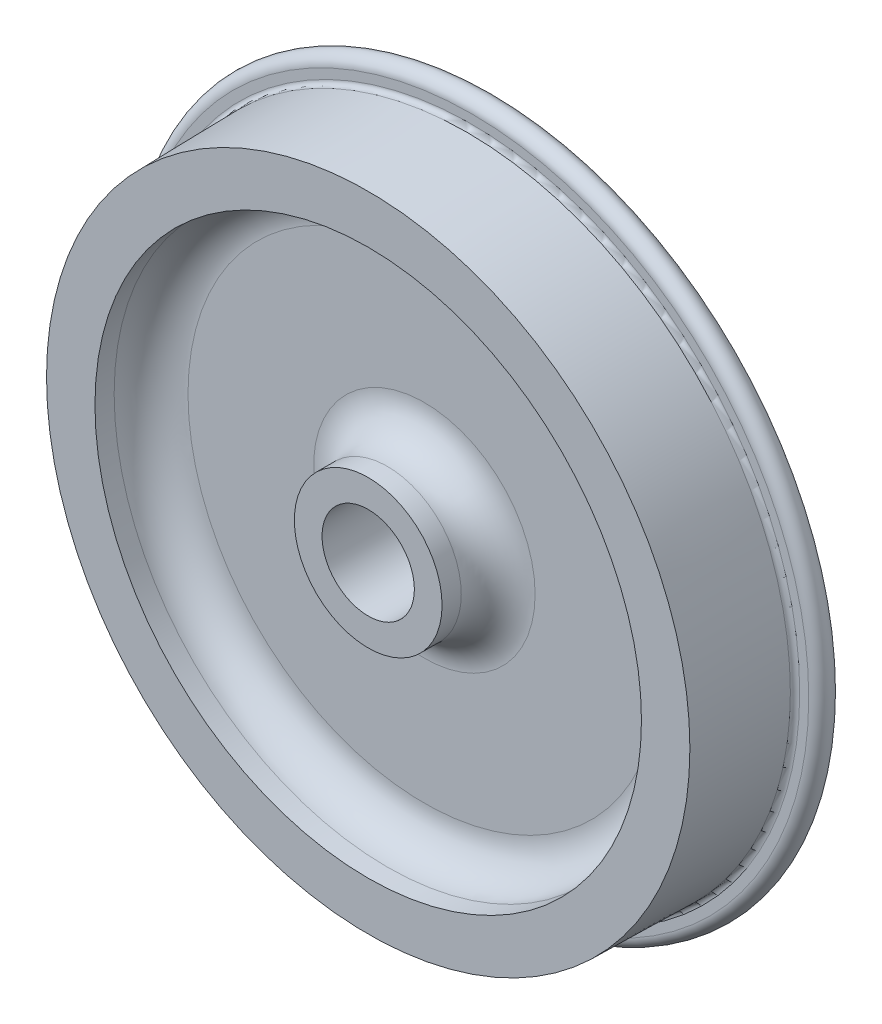
ISO-10303-21;
HEADER;
FILE_DESCRIPTION(('STEP AP214'),'2;1');
FILE_NAME('part.step','',(''),(''),'','','');
FILE_SCHEMA(('AUTOMOTIVE_DESIGN { 1 0 10303 214 1 1 1 1 }'));
ENDSEC;
DATA;
#1=APPLICATION_CONTEXT('core data for automotive mechanical design processes');
#2=APPLICATION_PROTOCOL_DEFINITION('international standard','automotive_design',2000,#1);
#3=PRODUCT_CONTEXT('',#1,'mechanical');
#4=PRODUCT('Part','Part','',(#3));
#5=PRODUCT_RELATED_PRODUCT_CATEGORY('part','',(#4));
#6=PRODUCT_DEFINITION_FORMATION('','',#4);
#7=PRODUCT_DEFINITION_CONTEXT('part definition',#1,'design');
#8=PRODUCT_DEFINITION('design','',#6,#7);
#9=PRODUCT_DEFINITION_SHAPE('','',#8);
#10=(LENGTH_UNIT() NAMED_UNIT(*) SI_UNIT(.MILLI.,.METRE.));
#11=(NAMED_UNIT(*) PLANE_ANGLE_UNIT() SI_UNIT($,.RADIAN.));
#12=(NAMED_UNIT(*) SI_UNIT($,.STERADIAN.) SOLID_ANGLE_UNIT());
#13=UNCERTAINTY_MEASURE_WITH_UNIT(LENGTH_MEASURE(1.E-05),#10,'distance_accuracy_value','');
#14=(GEOMETRIC_REPRESENTATION_CONTEXT(3) GLOBAL_UNCERTAINTY_ASSIGNED_CONTEXT((#13)) GLOBAL_UNIT_ASSIGNED_CONTEXT((#10,
#11,#12)) REPRESENTATION_CONTEXT('',''));
#15=CARTESIAN_POINT('',(0.,0.,0.));
#16=DIRECTION('',(0.,0.,1.));
#17=DIRECTION('',(1.,0.,0.));
#18=AXIS2_PLACEMENT_3D('',#15,#16,#17);
#19=CARTESIAN_POINT('',(0.,0.,-5.715));
#20=DIRECTION('',(0.,0.,1.));
#21=DIRECTION('',(1.,0.,0.));
#22=AXIS2_PLACEMENT_3D('',#19,#20,#21);
#23=TOROIDAL_SURFACE('',#22,57.9755,1.905);
#24=CARTESIAN_POINT('',(0.,0.,-7.62));
#25=DIRECTION('',(0.,0.,-1.));
#26=DIRECTION('',(-1.,0.,0.));
#27=AXIS2_PLACEMENT_3D('',#24,#25,#26);
#28=CIRCLE('',#27,57.9755);
#29=CARTESIAN_POINT('',(-57.9755,0.,-7.62));
#30=VERTEX_POINT('',#29);
#31=EDGE_CURVE('E41',#30,#30,#28,.T.);
#32=ORIENTED_EDGE('',*,*,#31,.F.);
#33=EDGE_LOOP('',(#32));
#34=FACE_BOUND('',#33,.T.);
#35=CARTESIAN_POINT('',(0.,0.,-3.81));
#36=DIRECTION('',(0.,0.,1.));
#37=DIRECTION('',(1.,0.,0.));
#38=AXIS2_PLACEMENT_3D('',#35,#36,#37);
#39=CIRCLE('',#38,57.9755);
#40=CARTESIAN_POINT('',(57.9755,0.,-3.81));
#41=VERTEX_POINT('',#40);
#42=EDGE_CURVE('E10',#41,#41,#39,.T.);
#43=ORIENTED_EDGE('',*,*,#42,.F.);
#44=EDGE_LOOP('',(#43));
#45=FACE_BOUND('',#44,.T.);
#46=ADVANCED_FACE('F35',(#34,#45),#23,.T.);
#47=CARTESIAN_POINT('',(0.,0.,-7.62));
#48=DIRECTION('',(0.,0.,-1.));
#49=DIRECTION('',(-1.,0.,0.));
#50=AXIS2_PLACEMENT_3D('',#47,#48,#49);
#51=PLANE('',#50);
#52=ORIENTED_EDGE('',*,*,#31,.T.);
#53=EDGE_LOOP('',(#52));
#54=FACE_BOUND('',#53,.T.);
#55=CARTESIAN_POINT('',(0.,0.,-7.62));
#56=DIRECTION('',(0.,0.,1.));
#57=DIRECTION('',(1.,0.,0.));
#58=AXIS2_PLACEMENT_3D('',#55,#56,#57);
#59=CIRCLE('',#58,7.9375);
#60=CARTESIAN_POINT('',(7.9375,0.,-7.62));
#61=VERTEX_POINT('',#60);
#62=EDGE_CURVE('E76',#61,#61,#59,.T.);
#63=ORIENTED_EDGE('',*,*,#62,.T.);
#64=EDGE_LOOP('',(#63));
#65=FACE_BOUND('',#64,.T.);
#66=ADVANCED_FACE('F82',(#54,#65),#51,.T.);
#67=CARTESIAN_POINT('',(0.,0.,-3.81));
#68=DIRECTION('',(0.,0.,1.));
#69=DIRECTION('',(1.,0.,0.));
#70=AXIS2_PLACEMENT_3D('',#67,#68,#69);
#71=PLANE('',#70);
#72=ORIENTED_EDGE('',*,*,#42,.T.);
#73=EDGE_LOOP('',(#72));
#74=FACE_BOUND('',#73,.T.);
#75=CARTESIAN_POINT('',(0.,0.,-3.81));
#76=DIRECTION('',(0.,0.,1.));
#77=DIRECTION('',(1.,0.,0.));
#78=AXIS2_PLACEMENT_3D('',#75,#76,#77);
#79=CIRCLE('',#78,56.4277401328369);
#80=CARTESIAN_POINT('',(56.4277401328369,0.,-3.81));
#81=VERTEX_POINT('',#80);
#82=EDGE_CURVE('E49',#81,#81,#79,.F.);
#83=ORIENTED_EDGE('',*,*,#82,.T.);
#84=EDGE_LOOP('',(#83));
#85=FACE_BOUND('',#84,.T.);
#86=ADVANCED_FACE('F117',(#74,#85),#71,.T.);
#87=CARTESIAN_POINT('',(0.,0.,13.97));
#88=DIRECTION('',(0.,0.,1.));
#89=DIRECTION('',(1.,0.,0.));
#90=AXIS2_PLACEMENT_3D('',#87,#88,#89);
#91=PLANE('',#90);
#92=CARTESIAN_POINT('',(0.,0.,13.97));
#93=DIRECTION('',(0.,0.,1.));
#94=DIRECTION('',(1.,0.,0.));
#95=AXIS2_PLACEMENT_3D('',#92,#93,#94);
#96=CIRCLE('',#95,46.99);
#97=CARTESIAN_POINT('',(46.99,0.,13.97));
#98=VERTEX_POINT('',#97);
#99=EDGE_CURVE('E70',#98,#98,#96,.T.);
#100=ORIENTED_EDGE('',*,*,#99,.F.);
#101=EDGE_LOOP('',(#100));
#102=FACE_BOUND('',#101,.T.);
#103=CARTESIAN_POINT('',(0.,0.,13.97));
#104=DIRECTION('',(0.,0.,1.));
#105=DIRECTION('',(1.,0.,0.));
#106=AXIS2_PLACEMENT_3D('',#103,#104,#105);
#107=CIRCLE('',#106,55.3186527429528);
#108=CARTESIAN_POINT('',(55.3186527429528,0.,13.97));
#109=VERTEX_POINT('',#108);
#110=EDGE_CURVE('E55',#109,#109,#107,.T.);
#111=ORIENTED_EDGE('',*,*,#110,.T.);
#112=EDGE_LOOP('',(#111));
#113=FACE_BOUND('',#112,.T.);
#114=ADVANCED_FACE('F98',(#102,#113),#91,.T.);
#115=CARTESIAN_POINT('',(0.,0.,4.318));
#116=DIRECTION('',(0.,0.,1.));
#117=DIRECTION('',(1.,0.,0.));
#118=AXIS2_PLACEMENT_3D('',#115,#116,#117);
#119=CYLINDRICAL_SURFACE('',#118,46.99);
#120=CARTESIAN_POINT('',(0.,0.,10.668));
#121=DIRECTION('',(0.,0.,1.));
#122=DIRECTION('',(1.,0.,0.));
#123=AXIS2_PLACEMENT_3D('',#120,#121,#122);
#124=CIRCLE('',#123,46.99);
#125=CARTESIAN_POINT('',(46.99,0.,10.668));
#126=VERTEX_POINT('',#125);
#127=EDGE_CURVE('E54',#126,#126,#124,.F.);
#128=ORIENTED_EDGE('',*,*,#127,.T.);
#129=EDGE_LOOP('',(#128));
#130=FACE_BOUND('',#129,.T.);
#131=ORIENTED_EDGE('',*,*,#99,.T.);
#132=EDGE_LOOP('',(#131));
#133=FACE_BOUND('',#132,.T.);
#134=ADVANCED_FACE('F108',(#130,#133),#119,.F.);
#135=CARTESIAN_POINT('',(0.,0.,4.318));
#136=DIRECTION('',(0.,0.,1.));
#137=DIRECTION('',(1.,0.,0.));
#138=AXIS2_PLACEMENT_3D('',#135,#136,#137);
#139=PLANE('',#138);
#140=CARTESIAN_POINT('',(0.,0.,4.318));
#141=DIRECTION('',(0.,0.,1.));
#142=DIRECTION('',(1.,0.,0.));
#143=AXIS2_PLACEMENT_3D('',#140,#141,#142);
#144=CIRCLE('',#143,19.05);
#145=CARTESIAN_POINT('',(19.05,0.,4.318));
#146=VERTEX_POINT('',#145);
#147=EDGE_CURVE('E61',#146,#146,#144,.F.);
#148=ORIENTED_EDGE('',*,*,#147,.T.);
#149=EDGE_LOOP('',(#148));
#150=FACE_BOUND('',#149,.T.);
#151=CARTESIAN_POINT('',(0.,0.,4.318));
#152=DIRECTION('',(0.,0.,1.));
#153=DIRECTION('',(1.,0.,0.));
#154=AXIS2_PLACEMENT_3D('',#151,#152,#153);
#155=CIRCLE('',#154,40.64);
#156=CARTESIAN_POINT('',(40.64,0.,4.318));
#157=VERTEX_POINT('',#156);
#158=EDGE_CURVE('E64',#157,#157,#155,.T.);
#159=ORIENTED_EDGE('',*,*,#158,.T.);
#160=EDGE_LOOP('',(#159));
#161=FACE_BOUND('',#160,.T.);
#162=ADVANCED_FACE('F102',(#150,#161),#139,.T.);
#163=CARTESIAN_POINT('',(0.,0.,4.318));
#164=DIRECTION('',(0.,0.,1.));
#165=DIRECTION('',(1.,0.,0.));
#166=AXIS2_PLACEMENT_3D('',#163,#164,#165);
#167=CYLINDRICAL_SURFACE('',#166,12.7);
#168=CARTESIAN_POINT('',(0.,0.,10.668));
#169=DIRECTION('',(0.,0.,1.));
#170=DIRECTION('',(1.,0.,0.));
#171=AXIS2_PLACEMENT_3D('',#168,#169,#170);
#172=CIRCLE('',#171,12.7);
#173=CARTESIAN_POINT('',(12.7,0.,10.668));
#174=VERTEX_POINT('',#173);
#175=EDGE_CURVE('E67',#174,#174,#172,.T.);
#176=ORIENTED_EDGE('',*,*,#175,.T.);
#177=EDGE_LOOP('',(#176));
#178=FACE_BOUND('',#177,.T.);
#179=CARTESIAN_POINT('',(0.,0.,13.97));
#180=DIRECTION('',(0.,0.,1.));
#181=DIRECTION('',(1.,0.,0.));
#182=AXIS2_PLACEMENT_3D('',#179,#180,#181);
#183=CIRCLE('',#182,12.7);
#184=CARTESIAN_POINT('',(12.7,0.,13.97));
#185=VERTEX_POINT('',#184);
#186=EDGE_CURVE('E73',#185,#185,#183,.T.);
#187=ORIENTED_EDGE('',*,*,#186,.F.);
#188=EDGE_LOOP('',(#187));
#189=FACE_BOUND('',#188,.T.);
#190=ADVANCED_FACE('F96',(#178,#189),#167,.T.);
#191=CARTESIAN_POINT('',(0.,0.,13.97));
#192=DIRECTION('',(0.,0.,1.));
#193=DIRECTION('',(1.,0.,0.));
#194=AXIS2_PLACEMENT_3D('',#191,#192,#193);
#195=CIRCLE('',#194,7.9375);
#196=CARTESIAN_POINT('',(7.9375,0.,13.97));
#197=VERTEX_POINT('',#196);
#198=EDGE_CURVE('E58',#197,#197,#195,.T.);
#199=ORIENTED_EDGE('',*,*,#198,.F.);
#200=EDGE_LOOP('',(#199));
#201=FACE_BOUND('',#200,.T.);
#202=ORIENTED_EDGE('',*,*,#186,.T.);
#203=EDGE_LOOP('',(#202));
#204=FACE_BOUND('',#203,.T.);
#205=ADVANCED_FACE('F92',(#201,#204),#91,.T.);
#206=CARTESIAN_POINT('',(0.,0.,10.668));
#207=DIRECTION('',(0.,0.,1.));
#208=DIRECTION('',(1.,0.,0.));
#209=AXIS2_PLACEMENT_3D('',#206,#207,#208);
#210=TOROIDAL_SURFACE('',#209,19.05,6.35);
#211=ORIENTED_EDGE('',*,*,#147,.F.);
#212=EDGE_LOOP('',(#211));
#213=FACE_BOUND('',#212,.T.);
#214=ORIENTED_EDGE('',*,*,#175,.F.);
#215=EDGE_LOOP('',(#214));
#216=FACE_BOUND('',#215,.T.);
#217=ADVANCED_FACE('F95',(#213,#216),#210,.F.);
#218=CARTESIAN_POINT('',(0.,0.,10.668));
#219=DIRECTION('',(0.,0.,1.));
#220=DIRECTION('',(1.,0.,0.));
#221=AXIS2_PLACEMENT_3D('',#218,#219,#220);
#222=TOROIDAL_SURFACE('',#221,40.64,6.35);
#223=ORIENTED_EDGE('',*,*,#127,.F.);
#224=EDGE_LOOP('',(#223));
#225=FACE_BOUND('',#224,.T.);
#226=ORIENTED_EDGE('',*,*,#158,.F.);
#227=EDGE_LOOP('',(#226));
#228=FACE_BOUND('',#227,.T.);
#229=ADVANCED_FACE('F88',(#225,#228),#222,.F.);
#230=CARTESIAN_POINT('',(0.,0.,-7.62));
#231=DIRECTION('',(0.,0.,1.));
#232=DIRECTION('',(1.,0.,0.));
#233=AXIS2_PLACEMENT_3D('',#230,#231,#232);
#234=CYLINDRICAL_SURFACE('',#233,7.9375);
#235=ORIENTED_EDGE('',*,*,#62,.F.);
#236=EDGE_LOOP('',(#235));
#237=FACE_BOUND('',#236,.T.);
#238=ORIENTED_EDGE('',*,*,#198,.T.);
#239=EDGE_LOOP('',(#238));
#240=FACE_BOUND('',#239,.T.);
#241=ADVANCED_FACE('F84',(#237,#240),#234,.F.);
#242=CARTESIAN_POINT('',(0.,0.,0.));
#243=DIRECTION('',(0.,0.,-1.));
#244=DIRECTION('',(1.,0.,0.));
#245=AXIS2_PLACEMENT_3D('',#242,#243,#244);
#246=CONICAL_SURFACE('',#245,55.5625,0.0174532925199433);
#247=CARTESIAN_POINT('',(0.,0.,-3.01138531595222));
#248=DIRECTION('',(0.,0.,-1.));
#249=DIRECTION('',(-1.,0.,0.));
#250=AXIS2_PLACEMENT_3D('',#247,#248,#249);
#251=CIRCLE('',#250,55.6150639262138);
#252=CARTESIAN_POINT('',(-55.6150639262138,0.,-3.01138531595222));
#253=VERTEX_POINT('',#252);
#254=EDGE_CURVE('E45',#253,#253,#251,.F.);
#255=ORIENTED_EDGE('',*,*,#254,.T.);
#256=EDGE_LOOP('',(#255));
#257=FACE_BOUND('',#256,.T.);
#258=ORIENTED_EDGE('',*,*,#110,.F.);
#259=EDGE_LOOP('',(#258));
#260=FACE_BOUND('',#259,.T.);
#261=ADVANCED_FACE('F87',(#257,#260),#246,.T.);
#262=CARTESIAN_POINT('',(0.,0.,-2.9972));
#263=DIRECTION('',(0.,0.,1.));
#264=DIRECTION('',(1.,0.,0.));
#265=AXIS2_PLACEMENT_3D('',#262,#263,#264);
#266=TOROIDAL_SURFACE('',#265,56.4277401328369,0.8128);
#267=ORIENTED_EDGE('',*,*,#254,.F.);
#268=EDGE_LOOP('',(#267));
#269=FACE_BOUND('',#268,.T.);
#270=ORIENTED_EDGE('',*,*,#82,.F.);
#271=EDGE_LOOP('',(#270));
#272=FACE_BOUND('',#271,.T.);
#273=ADVANCED_FACE('F130',(#269,#272),#266,.F.);
#274=CLOSED_SHELL('',(#46,#66,#86,#114,#134,#162,#190,#205,#217,#229,#241,#261,#273));
#275=MANIFOLD_SOLID_BREP('B2',#274);
#276=ADVANCED_BREP_SHAPE_REPRESENTATION('',(#18,#275),#14);
#277=SHAPE_DEFINITION_REPRESENTATION(#9,#276);
ENDSEC;
END-ISO-10303-21;
